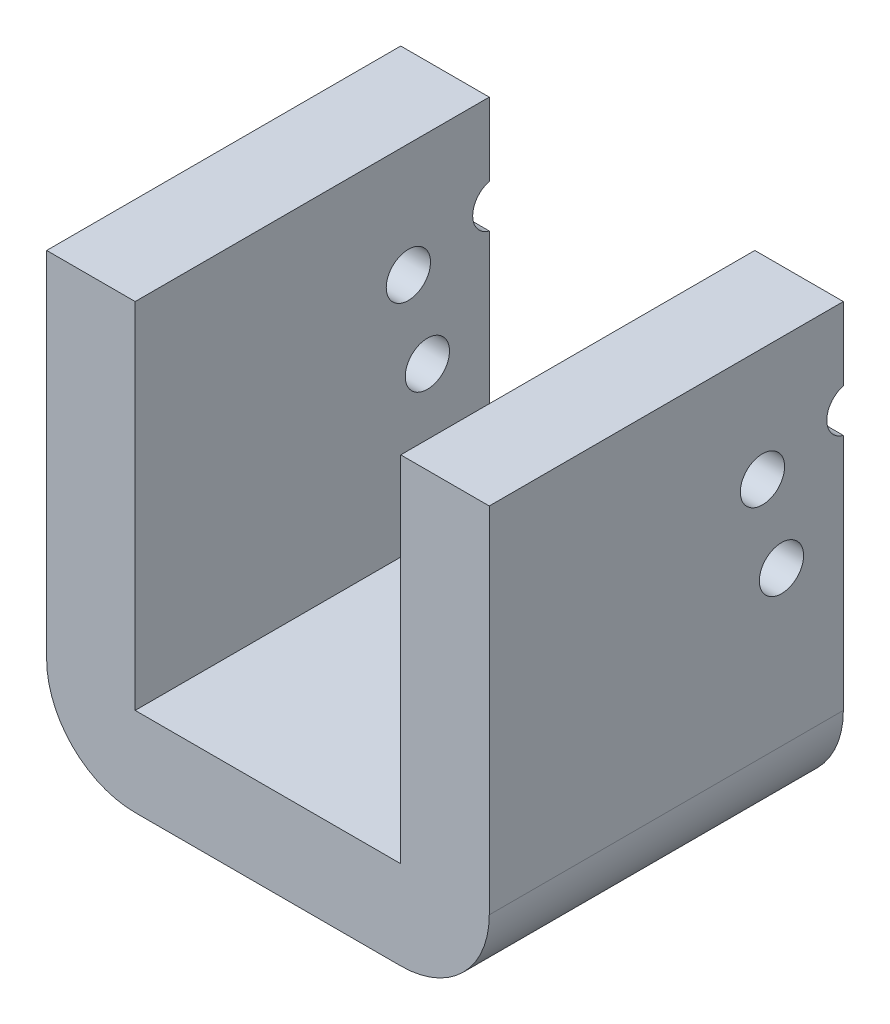
ISO-10303-21;
HEADER;
FILE_DESCRIPTION(('STEP AP214'),'2;1');
FILE_NAME('part.step','',(''),(''),'','','');
FILE_SCHEMA(('AUTOMOTIVE_DESIGN { 1 0 10303 214 1 1 1 1 }'));
ENDSEC;
DATA;
#1=APPLICATION_CONTEXT('core data for automotive mechanical design processes');
#2=APPLICATION_PROTOCOL_DEFINITION('international standard','automotive_design',2000,#1);
#3=PRODUCT_CONTEXT('',#1,'mechanical');
#4=PRODUCT('Part','Part','',(#3));
#5=PRODUCT_RELATED_PRODUCT_CATEGORY('part','',(#4));
#6=PRODUCT_DEFINITION_FORMATION('','',#4);
#7=PRODUCT_DEFINITION_CONTEXT('part definition',#1,'design');
#8=PRODUCT_DEFINITION('design','',#6,#7);
#9=PRODUCT_DEFINITION_SHAPE('','',#8);
#10=(LENGTH_UNIT() NAMED_UNIT(*) SI_UNIT(.MILLI.,.METRE.));
#11=(NAMED_UNIT(*) PLANE_ANGLE_UNIT() SI_UNIT($,.RADIAN.));
#12=(NAMED_UNIT(*) SI_UNIT($,.STERADIAN.) SOLID_ANGLE_UNIT());
#13=UNCERTAINTY_MEASURE_WITH_UNIT(LENGTH_MEASURE(1.E-05),#10,'distance_accuracy_value','');
#14=(GEOMETRIC_REPRESENTATION_CONTEXT(3) GLOBAL_UNCERTAINTY_ASSIGNED_CONTEXT((#13)) GLOBAL_UNIT_ASSIGNED_CONTEXT((#10,
#11,#12)) REPRESENTATION_CONTEXT('',''));
#15=CARTESIAN_POINT('',(0.,0.,0.));
#16=DIRECTION('',(0.,0.,1.));
#17=DIRECTION('',(1.,0.,0.));
#18=AXIS2_PLACEMENT_3D('',#15,#16,#17);
#19=CARTESIAN_POINT('',(0.,0.,0.));
#20=DIRECTION('',(0.,0.,-1.));
#21=DIRECTION('',(-1.,0.,0.));
#22=AXIS2_PLACEMENT_3D('',#19,#20,#21);
#23=PLANE('',#22);
#24=DIRECTION('',(-1.,0.,0.));
#25=VECTOR('',#24,1.);
#26=CARTESIAN_POINT('',(60.,36.9057321288444,0.));
#27=LINE('',#26,#25);
#28=CARTESIAN_POINT('',(50.,36.9057321288444,0.));
#29=VERTEX_POINT('',#28);
#30=CARTESIAN_POINT('',(40.,36.9057321288444,0.));
#31=VERTEX_POINT('',#30);
#32=EDGE_CURVE('E11',#29,#31,#27,.T.);
#33=ORIENTED_EDGE('',*,*,#32,.F.);
#34=DIRECTION('',(0.,1.,0.));
#35=VECTOR('',#34,1.);
#36=CARTESIAN_POINT('',(50.,50.,0.));
#37=LINE('',#36,#35);
#38=CARTESIAN_POINT('',(50.,9.99999999999999,0.));
#39=VERTEX_POINT('',#38);
#40=EDGE_CURVE('E222',#39,#29,#37,.T.);
#41=ORIENTED_EDGE('',*,*,#40,.F.);
#42=CARTESIAN_POINT('',(40.,9.99999999999999,0.));
#43=DIRECTION('',(0.,0.,-1.));
#44=DIRECTION('',(-1.,0.,0.));
#45=AXIS2_PLACEMENT_3D('',#42,#43,#44);
#46=CIRCLE('',#45,10.);
#47=CARTESIAN_POINT('',(40.,0.,0.));
#48=VERTEX_POINT('',#47);
#49=EDGE_CURVE('E188',#39,#48,#46,.T.);
#50=ORIENTED_EDGE('',*,*,#49,.T.);
#51=DIRECTION('',(1.,0.,0.));
#52=VECTOR('',#51,1.);
#53=CARTESIAN_POINT('',(50.,0.,0.));
#54=LINE('',#53,#52);
#55=CARTESIAN_POINT('',(10.,0.,0.));
#56=VERTEX_POINT('',#55);
#57=EDGE_CURVE('E226',#56,#48,#54,.T.);
#58=ORIENTED_EDGE('',*,*,#57,.F.);
#59=CARTESIAN_POINT('',(10.,10.,0.));
#60=DIRECTION('',(0.,0.,-1.));
#61=DIRECTION('',(-1.,0.,0.));
#62=AXIS2_PLACEMENT_3D('',#59,#60,#61);
#63=CIRCLE('',#62,10.);
#64=CARTESIAN_POINT('',(0.,10.,0.));
#65=VERTEX_POINT('',#64);
#66=EDGE_CURVE('E157',#56,#65,#63,.T.);
#67=ORIENTED_EDGE('',*,*,#66,.T.);
#68=DIRECTION('',(0.,-1.,0.));
#69=VECTOR('',#68,1.);
#70=CARTESIAN_POINT('',(0.,0.,0.));
#71=LINE('',#70,#69);
#72=CARTESIAN_POINT('',(0.,36.9057321288444,0.));
#73=VERTEX_POINT('',#72);
#74=EDGE_CURVE('E148',#73,#65,#71,.T.);
#75=ORIENTED_EDGE('',*,*,#74,.F.);
#76=CARTESIAN_POINT('',(10.,36.9057321288444,0.));
#77=VERTEX_POINT('',#76);
#78=EDGE_CURVE('E43',#77,#73,#27,.T.);
#79=ORIENTED_EDGE('',*,*,#78,.F.);
#80=DIRECTION('',(0.,1.,0.));
#81=VECTOR('',#80,1.);
#82=CARTESIAN_POINT('',(10.,50.,0.));
#83=LINE('',#82,#81);
#84=CARTESIAN_POINT('',(10.,10.,0.));
#85=VERTEX_POINT('',#84);
#86=EDGE_CURVE('E162',#85,#77,#83,.T.);
#87=ORIENTED_EDGE('',*,*,#86,.F.);
#88=DIRECTION('',(-1.,0.,0.));
#89=VECTOR('',#88,1.);
#90=CARTESIAN_POINT('',(10.,10.,0.));
#91=LINE('',#90,#89);
#92=CARTESIAN_POINT('',(40.,10.,0.));
#93=VERTEX_POINT('',#92);
#94=EDGE_CURVE('E213',#93,#85,#91,.T.);
#95=ORIENTED_EDGE('',*,*,#94,.F.);
#96=DIRECTION('',(0.,-1.,0.));
#97=VECTOR('',#96,1.);
#98=CARTESIAN_POINT('',(40.,10.,0.));
#99=LINE('',#98,#97);
#100=EDGE_CURVE('E219',#31,#93,#99,.T.);
#101=ORIENTED_EDGE('',*,*,#100,.F.);
#102=EDGE_LOOP('',(#33,#41,#50,#58,#67,#75,#79,#87,#95,#101));
#103=FACE_BOUND('',#102,.T.);
#104=ADVANCED_FACE('F39',(#103),#23,.T.);
#105=DIRECTION('',(-1.,0.,0.));
#106=VECTOR('',#105,1.);
#107=CARTESIAN_POINT('',(60.,41.7456145954179,0.));
#108=LINE('',#107,#106);
#109=CARTESIAN_POINT('',(0.,41.7456145954179,0.));
#110=VERTEX_POINT('',#109);
#111=CARTESIAN_POINT('',(10.,41.7456145954179,0.));
#112=VERTEX_POINT('',#111);
#113=EDGE_CURVE('E144',#110,#112,#108,.F.);
#114=ORIENTED_EDGE('',*,*,#113,.F.);
#115=CARTESIAN_POINT('',(0.,50.,0.));
#116=VERTEX_POINT('',#115);
#117=EDGE_CURVE('E152',#116,#110,#71,.T.);
#118=ORIENTED_EDGE('',*,*,#117,.F.);
#119=DIRECTION('',(-1.,0.,0.));
#120=VECTOR('',#119,1.);
#121=CARTESIAN_POINT('',(0.,50.,0.));
#122=LINE('',#121,#120);
#123=CARTESIAN_POINT('',(10.,50.,0.));
#124=VERTEX_POINT('',#123);
#125=EDGE_CURVE('E159',#124,#116,#122,.T.);
#126=ORIENTED_EDGE('',*,*,#125,.F.);
#127=EDGE_CURVE('E207',#112,#124,#83,.T.);
#128=ORIENTED_EDGE('',*,*,#127,.F.);
#129=EDGE_LOOP('',(#114,#118,#126,#128));
#130=FACE_BOUND('',#129,.T.);
#131=ADVANCED_FACE('F212',(#130),#23,.T.);
#132=CARTESIAN_POINT('',(50.,0.,40.));
#133=DIRECTION('',(0.,1.,0.));
#134=DIRECTION('',(-1.,0.,0.));
#135=AXIS2_PLACEMENT_3D('',#132,#133,#134);
#136=PLANE('',#135);
#137=ORIENTED_EDGE('',*,*,#57,.T.);
#138=DIRECTION('',(0.,0.,-1.));
#139=VECTOR('',#138,1.);
#140=CARTESIAN_POINT('',(40.,0.,40.));
#141=LINE('',#140,#139);
#142=CARTESIAN_POINT('',(40.,0.,40.));
#143=VERTEX_POINT('',#142);
#144=EDGE_CURVE('E193',#48,#143,#141,.F.);
#145=ORIENTED_EDGE('',*,*,#144,.T.);
#146=DIRECTION('',(1.,0.,0.));
#147=VECTOR('',#146,1.);
#148=CARTESIAN_POINT('',(50.,0.,40.));
#149=LINE('',#148,#147);
#150=CARTESIAN_POINT('',(10.,0.,40.));
#151=VERTEX_POINT('',#150);
#152=EDGE_CURVE('E161',#151,#143,#149,.T.);
#153=ORIENTED_EDGE('',*,*,#152,.F.);
#154=DIRECTION('',(0.,0.,-1.));
#155=VECTOR('',#154,1.);
#156=CARTESIAN_POINT('',(10.,0.,40.));
#157=LINE('',#156,#155);
#158=EDGE_CURVE('E190',#151,#56,#157,.T.);
#159=ORIENTED_EDGE('',*,*,#158,.T.);
#160=EDGE_LOOP('',(#137,#145,#153,#159));
#161=FACE_BOUND('',#160,.T.);
#162=ADVANCED_FACE('F293',(#161),#136,.F.);
#163=CARTESIAN_POINT('',(50.,50.,40.));
#164=DIRECTION('',(-1.,0.,0.));
#165=DIRECTION('',(0.,-1.,0.));
#166=AXIS2_PLACEMENT_3D('',#163,#164,#165);
#167=PLANE('',#166);
#168=CARTESIAN_POINT('',(50.,27.4103411852505,6.98980288674551));
#169=DIRECTION('',(-1.,0.,0.));
#170=DIRECTION('',(0.,-1.,0.));
#171=AXIS2_PLACEMENT_3D('',#168,#169,#170);
#172=CIRCLE('',#171,2.5);
#173=CARTESIAN_POINT('',(50.,24.9103411852505,6.98980288674551));
#174=VERTEX_POINT('',#173);
#175=EDGE_CURVE('E229',#174,#174,#172,.T.);
#176=ORIENTED_EDGE('',*,*,#175,.T.);
#177=EDGE_LOOP('',(#176));
#178=FACE_BOUND('',#177,.T.);
#179=CARTESIAN_POINT('',(50.,37.176709779617,9.13876646925967));
#180=DIRECTION('',(-1.,0.,0.));
#181=DIRECTION('',(0.,-1.,0.));
#182=AXIS2_PLACEMENT_3D('',#179,#180,#181);
#183=CIRCLE('',#182,2.5);
#184=CARTESIAN_POINT('',(50.,34.676709779617,9.13876646925967));
#185=VERTEX_POINT('',#184);
#186=EDGE_CURVE('E254',#185,#185,#183,.T.);
#187=ORIENTED_EDGE('',*,*,#186,.T.);
#188=EDGE_LOOP('',(#187));
#189=FACE_BOUND('',#188,.T.);
#190=ORIENTED_EDGE('',*,*,#40,.T.);
#191=CARTESIAN_POINT('',(50.,39.3256733621311,-0.627602125106819));
#192=DIRECTION('',(-1.,0.,0.));
#193=DIRECTION('',(0.,-1.,0.));
#194=AXIS2_PLACEMENT_3D('',#191,#192,#193);
#195=CIRCLE('',#194,2.5);
#196=CARTESIAN_POINT('',(50.,41.7456145954179,0.));
#197=VERTEX_POINT('',#196);
#198=EDGE_CURVE('E209',#29,#197,#195,.T.);
#199=ORIENTED_EDGE('',*,*,#198,.T.);
#200=CARTESIAN_POINT('',(50.,50.,0.));
#201=VERTEX_POINT('',#200);
#202=EDGE_CURVE('E225',#197,#201,#37,.T.);
#203=ORIENTED_EDGE('',*,*,#202,.T.);
#204=DIRECTION('',(0.,0.,-1.));
#205=VECTOR('',#204,1.);
#206=CARTESIAN_POINT('',(50.,50.,40.));
#207=LINE('',#206,#205);
#208=CARTESIAN_POINT('',(50.,50.,40.));
#209=VERTEX_POINT('',#208);
#210=EDGE_CURVE('E181',#209,#201,#207,.T.);
#211=ORIENTED_EDGE('',*,*,#210,.F.);
#212=DIRECTION('',(0.,1.,0.));
#213=VECTOR('',#212,1.);
#214=CARTESIAN_POINT('',(50.,50.,40.));
#215=LINE('',#214,#213);
#216=CARTESIAN_POINT('',(50.,9.99999999999999,40.));
#217=VERTEX_POINT('',#216);
#218=EDGE_CURVE('E242',#217,#209,#215,.T.);
#219=ORIENTED_EDGE('',*,*,#218,.F.);
#220=DIRECTION('',(0.,0.,-1.));
#221=VECTOR('',#220,1.);
#222=CARTESIAN_POINT('',(50.,9.99999999999999,40.));
#223=LINE('',#222,#221);
#224=EDGE_CURVE('E184',#217,#39,#223,.T.);
#225=ORIENTED_EDGE('',*,*,#224,.T.);
#226=EDGE_LOOP('',(#190,#199,#203,#211,#219,#225));
#227=FACE_BOUND('',#226,.T.);
#228=ADVANCED_FACE('F316',(#178,#189,#227),#167,.F.);
#229=CARTESIAN_POINT('',(40.,50.,40.));
#230=DIRECTION('',(0.,-1.,0.));
#231=DIRECTION('',(0.,0.,-1.));
#232=AXIS2_PLACEMENT_3D('',#229,#230,#231);
#233=PLANE('',#232);
#234=DIRECTION('',(-1.,0.,0.));
#235=VECTOR('',#234,1.);
#236=CARTESIAN_POINT('',(40.,50.,0.));
#237=LINE('',#236,#235);
#238=CARTESIAN_POINT('',(40.,50.,0.));
#239=VERTEX_POINT('',#238);
#240=EDGE_CURVE('E220',#201,#239,#237,.T.);
#241=ORIENTED_EDGE('',*,*,#240,.T.);
#242=DIRECTION('',(0.,0.,-1.));
#243=VECTOR('',#242,1.);
#244=CARTESIAN_POINT('',(40.,50.,40.));
#245=LINE('',#244,#243);
#246=CARTESIAN_POINT('',(40.,50.,40.));
#247=VERTEX_POINT('',#246);
#248=EDGE_CURVE('E178',#247,#239,#245,.T.);
#249=ORIENTED_EDGE('',*,*,#248,.F.);
#250=DIRECTION('',(-1.,0.,0.));
#251=VECTOR('',#250,1.);
#252=CARTESIAN_POINT('',(40.,50.,40.));
#253=LINE('',#252,#251);
#254=EDGE_CURVE('E240',#209,#247,#253,.T.);
#255=ORIENTED_EDGE('',*,*,#254,.F.);
#256=ORIENTED_EDGE('',*,*,#210,.T.);
#257=EDGE_LOOP('',(#241,#249,#255,#256));
#258=FACE_BOUND('',#257,.T.);
#259=ADVANCED_FACE('F312',(#258),#233,.F.);
#260=CARTESIAN_POINT('',(40.,10.,40.));
#261=DIRECTION('',(1.,0.,0.));
#262=DIRECTION('',(0.,1.,0.));
#263=AXIS2_PLACEMENT_3D('',#260,#261,#262);
#264=PLANE('',#263);
#265=CARTESIAN_POINT('',(40.,27.4103411852505,6.98980288674551));
#266=DIRECTION('',(1.,0.,0.));
#267=DIRECTION('',(0.,1.,0.));
#268=AXIS2_PLACEMENT_3D('',#265,#266,#267);
#269=CIRCLE('',#268,2.5);
#270=CARTESIAN_POINT('',(40.,29.9103411852505,6.98980288674551));
#271=VERTEX_POINT('',#270);
#272=EDGE_CURVE('E248',#271,#271,#269,.T.);
#273=ORIENTED_EDGE('',*,*,#272,.T.);
#274=EDGE_LOOP('',(#273));
#275=FACE_BOUND('',#274,.T.);
#276=CARTESIAN_POINT('',(40.,37.176709779617,9.13876646925967));
#277=DIRECTION('',(1.,0.,0.));
#278=DIRECTION('',(0.,1.,0.));
#279=AXIS2_PLACEMENT_3D('',#276,#277,#278);
#280=CIRCLE('',#279,2.5);
#281=CARTESIAN_POINT('',(40.,39.676709779617,9.13876646925967));
#282=VERTEX_POINT('',#281);
#283=EDGE_CURVE('E257',#282,#282,#280,.T.);
#284=ORIENTED_EDGE('',*,*,#283,.T.);
#285=EDGE_LOOP('',(#284));
#286=FACE_BOUND('',#285,.T.);
#287=CARTESIAN_POINT('',(40.,41.7456145954179,0.));
#288=VERTEX_POINT('',#287);
#289=EDGE_CURVE('E214',#239,#288,#99,.T.);
#290=ORIENTED_EDGE('',*,*,#289,.T.);
#291=CARTESIAN_POINT('',(40.,39.3256733621311,-0.627602125106819));
#292=DIRECTION('',(1.,0.,0.));
#293=DIRECTION('',(0.,1.,0.));
#294=AXIS2_PLACEMENT_3D('',#291,#292,#293);
#295=CIRCLE('',#294,2.5);
#296=EDGE_CURVE('E53',#288,#31,#295,.T.);
#297=ORIENTED_EDGE('',*,*,#296,.T.);
#298=ORIENTED_EDGE('',*,*,#100,.T.);
#299=DIRECTION('',(0.,0.,-1.));
#300=VECTOR('',#299,1.);
#301=CARTESIAN_POINT('',(40.,10.,40.));
#302=LINE('',#301,#300);
#303=CARTESIAN_POINT('',(40.,10.,40.));
#304=VERTEX_POINT('',#303);
#305=EDGE_CURVE('E175',#304,#93,#302,.T.);
#306=ORIENTED_EDGE('',*,*,#305,.F.);
#307=DIRECTION('',(0.,-1.,0.));
#308=VECTOR('',#307,1.);
#309=CARTESIAN_POINT('',(40.,10.,40.));
#310=LINE('',#309,#308);
#311=EDGE_CURVE('E238',#247,#304,#310,.T.);
#312=ORIENTED_EDGE('',*,*,#311,.F.);
#313=ORIENTED_EDGE('',*,*,#248,.T.);
#314=EDGE_LOOP('',(#290,#297,#298,#306,#312,#313));
#315=FACE_BOUND('',#314,.T.);
#316=ADVANCED_FACE('F305',(#275,#286,#315),#264,.F.);
#317=CARTESIAN_POINT('',(10.,10.,40.));
#318=DIRECTION('',(0.,-1.,0.));
#319=DIRECTION('',(0.,0.,-1.));
#320=AXIS2_PLACEMENT_3D('',#317,#318,#319);
#321=PLANE('',#320);
#322=ORIENTED_EDGE('',*,*,#94,.T.);
#323=DIRECTION('',(0.,0.,-1.));
#324=VECTOR('',#323,1.);
#325=CARTESIAN_POINT('',(10.,10.,40.));
#326=LINE('',#325,#324);
#327=CARTESIAN_POINT('',(10.,10.,40.));
#328=VERTEX_POINT('',#327);
#329=EDGE_CURVE('E172',#328,#85,#326,.T.);
#330=ORIENTED_EDGE('',*,*,#329,.F.);
#331=DIRECTION('',(-1.,0.,0.));
#332=VECTOR('',#331,1.);
#333=CARTESIAN_POINT('',(10.,10.,40.));
#334=LINE('',#333,#332);
#335=EDGE_CURVE('E236',#304,#328,#334,.T.);
#336=ORIENTED_EDGE('',*,*,#335,.F.);
#337=ORIENTED_EDGE('',*,*,#305,.T.);
#338=EDGE_LOOP('',(#322,#330,#336,#337));
#339=FACE_BOUND('',#338,.T.);
#340=ADVANCED_FACE('F323',(#339),#321,.F.);
#341=CARTESIAN_POINT('',(10.,50.,40.));
#342=DIRECTION('',(-1.,0.,0.));
#343=DIRECTION('',(0.,-1.,0.));
#344=AXIS2_PLACEMENT_3D('',#341,#342,#343);
#345=PLANE('',#344);
#346=CARTESIAN_POINT('',(10.,27.4103411852505,6.98980288674551));
#347=DIRECTION('',(-1.,0.,0.));
#348=DIRECTION('',(0.,-1.,0.));
#349=AXIS2_PLACEMENT_3D('',#346,#347,#348);
#350=CIRCLE('',#349,2.5);
#351=CARTESIAN_POINT('',(10.,24.9103411852505,6.98980288674551));
#352=VERTEX_POINT('',#351);
#353=EDGE_CURVE('E251',#352,#352,#350,.T.);
#354=ORIENTED_EDGE('',*,*,#353,.T.);
#355=EDGE_LOOP('',(#354));
#356=FACE_BOUND('',#355,.T.);
#357=CARTESIAN_POINT('',(10.,37.176709779617,9.13876646925967));
#358=DIRECTION('',(-1.,0.,0.));
#359=DIRECTION('',(0.,-1.,0.));
#360=AXIS2_PLACEMENT_3D('',#357,#358,#359);
#361=CIRCLE('',#360,2.5);
#362=CARTESIAN_POINT('',(10.,34.676709779617,9.13876646925967));
#363=VERTEX_POINT('',#362);
#364=EDGE_CURVE('E208',#363,#363,#361,.T.);
#365=ORIENTED_EDGE('',*,*,#364,.T.);
#366=EDGE_LOOP('',(#365));
#367=FACE_BOUND('',#366,.T.);
#368=ORIENTED_EDGE('',*,*,#86,.T.);
#369=CARTESIAN_POINT('',(10.,39.3256733621311,-0.627602125106819));
#370=DIRECTION('',(-1.,0.,0.));
#371=DIRECTION('',(0.,-1.,0.));
#372=AXIS2_PLACEMENT_3D('',#369,#370,#371);
#373=CIRCLE('',#372,2.5);
#374=EDGE_CURVE('E139',#77,#112,#373,.T.);
#375=ORIENTED_EDGE('',*,*,#374,.T.);
#376=ORIENTED_EDGE('',*,*,#127,.T.);
#377=DIRECTION('',(0.,0.,-1.));
#378=VECTOR('',#377,1.);
#379=CARTESIAN_POINT('',(10.,50.,40.));
#380=LINE('',#379,#378);
#381=CARTESIAN_POINT('',(10.,50.,40.));
#382=VERTEX_POINT('',#381);
#383=EDGE_CURVE('E168',#382,#124,#380,.T.);
#384=ORIENTED_EDGE('',*,*,#383,.F.);
#385=DIRECTION('',(0.,1.,0.));
#386=VECTOR('',#385,1.);
#387=CARTESIAN_POINT('',(10.,50.,40.));
#388=LINE('',#387,#386);
#389=EDGE_CURVE('E234',#328,#382,#388,.T.);
#390=ORIENTED_EDGE('',*,*,#389,.F.);
#391=ORIENTED_EDGE('',*,*,#329,.T.);
#392=EDGE_LOOP('',(#368,#375,#376,#384,#390,#391));
#393=FACE_BOUND('',#392,.T.);
#394=ADVANCED_FACE('F205',(#356,#367,#393),#345,.F.);
#395=CARTESIAN_POINT('',(0.,50.,40.));
#396=DIRECTION('',(0.,-1.,0.));
#397=DIRECTION('',(0.,0.,-1.));
#398=AXIS2_PLACEMENT_3D('',#395,#396,#397);
#399=PLANE('',#398);
#400=ORIENTED_EDGE('',*,*,#125,.T.);
#401=DIRECTION('',(0.,0.,-1.));
#402=VECTOR('',#401,1.);
#403=CARTESIAN_POINT('',(0.,50.,40.));
#404=LINE('',#403,#402);
#405=CARTESIAN_POINT('',(0.,50.,40.));
#406=VERTEX_POINT('',#405);
#407=EDGE_CURVE('E166',#406,#116,#404,.T.);
#408=ORIENTED_EDGE('',*,*,#407,.F.);
#409=DIRECTION('',(-1.,0.,0.));
#410=VECTOR('',#409,1.);
#411=CARTESIAN_POINT('',(0.,50.,40.));
#412=LINE('',#411,#410);
#413=EDGE_CURVE('E232',#382,#406,#412,.T.);
#414=ORIENTED_EDGE('',*,*,#413,.F.);
#415=ORIENTED_EDGE('',*,*,#383,.T.);
#416=EDGE_LOOP('',(#400,#408,#414,#415));
#417=FACE_BOUND('',#416,.T.);
#418=ADVANCED_FACE('F275',(#417),#399,.F.);
#419=CARTESIAN_POINT('',(0.,0.,40.));
#420=DIRECTION('',(1.,0.,0.));
#421=DIRECTION('',(0.,0.,-1.));
#422=AXIS2_PLACEMENT_3D('',#419,#420,#421);
#423=PLANE('',#422);
#424=CARTESIAN_POINT('',(0.,27.4103411852505,6.98980288674551));
#425=DIRECTION('',(-1.,0.,0.));
#426=DIRECTION('',(0.,0.,1.));
#427=AXIS2_PLACEMENT_3D('',#424,#425,#426);
#428=CIRCLE('',#427,2.5);
#429=CARTESIAN_POINT('',(0.,27.4103411852505,9.48980288674551));
#430=VERTEX_POINT('',#429);
#431=EDGE_CURVE('E264',#430,#430,#428,.T.);
#432=ORIENTED_EDGE('',*,*,#431,.F.);
#433=EDGE_LOOP('',(#432));
#434=FACE_BOUND('',#433,.T.);
#435=CARTESIAN_POINT('',(0.,37.176709779617,9.13876646925967));
#436=DIRECTION('',(-1.,0.,0.));
#437=DIRECTION('',(0.,0.,1.));
#438=AXIS2_PLACEMENT_3D('',#435,#436,#437);
#439=CIRCLE('',#438,2.5);
#440=CARTESIAN_POINT('',(0.,37.176709779617,11.6387664692597));
#441=VERTEX_POINT('',#440);
#442=EDGE_CURVE('E153',#441,#441,#439,.T.);
#443=ORIENTED_EDGE('',*,*,#442,.F.);
#444=EDGE_LOOP('',(#443));
#445=FACE_BOUND('',#444,.T.);
#446=ORIENTED_EDGE('',*,*,#117,.T.);
#447=CARTESIAN_POINT('',(0.,39.3256733621311,-0.627602125106819));
#448=DIRECTION('',(-1.,0.,0.));
#449=DIRECTION('',(0.,0.,1.));
#450=AXIS2_PLACEMENT_3D('',#447,#448,#449);
#451=CIRCLE('',#450,2.5);
#452=EDGE_CURVE('E61',#73,#110,#451,.T.);
#453=ORIENTED_EDGE('',*,*,#452,.F.);
#454=ORIENTED_EDGE('',*,*,#74,.T.);
#455=DIRECTION('',(0.,0.,-1.));
#456=VECTOR('',#455,1.);
#457=CARTESIAN_POINT('',(0.,10.,40.));
#458=LINE('',#457,#456);
#459=CARTESIAN_POINT('',(0.,10.,40.));
#460=VERTEX_POINT('',#459);
#461=EDGE_CURVE('E199',#65,#460,#458,.F.);
#462=ORIENTED_EDGE('',*,*,#461,.T.);
#463=DIRECTION('',(0.,-1.,0.));
#464=VECTOR('',#463,1.);
#465=CARTESIAN_POINT('',(0.,0.,40.));
#466=LINE('',#465,#464);
#467=EDGE_CURVE('E169',#406,#460,#466,.T.);
#468=ORIENTED_EDGE('',*,*,#467,.F.);
#469=ORIENTED_EDGE('',*,*,#407,.T.);
#470=EDGE_LOOP('',(#446,#453,#454,#462,#468,#469));
#471=FACE_BOUND('',#470,.T.);
#472=ADVANCED_FACE('F147',(#434,#445,#471),#423,.F.);
#473=CARTESIAN_POINT('',(0.,0.,40.));
#474=DIRECTION('',(0.,0.,-1.));
#475=DIRECTION('',(-1.,0.,0.));
#476=AXIS2_PLACEMENT_3D('',#473,#474,#475);
#477=PLANE('',#476);
#478=ORIENTED_EDGE('',*,*,#152,.T.);
#479=CARTESIAN_POINT('',(40.,9.99999999999999,40.));
#480=DIRECTION('',(0.,0.,-1.));
#481=DIRECTION('',(-1.,0.,0.));
#482=AXIS2_PLACEMENT_3D('',#479,#480,#481);
#483=CIRCLE('',#482,10.);
#484=EDGE_CURVE('E197',#143,#217,#483,.F.);
#485=ORIENTED_EDGE('',*,*,#484,.T.);
#486=ORIENTED_EDGE('',*,*,#218,.T.);
#487=ORIENTED_EDGE('',*,*,#254,.T.);
#488=ORIENTED_EDGE('',*,*,#311,.T.);
#489=ORIENTED_EDGE('',*,*,#335,.T.);
#490=ORIENTED_EDGE('',*,*,#389,.T.);
#491=ORIENTED_EDGE('',*,*,#413,.T.);
#492=ORIENTED_EDGE('',*,*,#467,.T.);
#493=CARTESIAN_POINT('',(10.,10.,40.));
#494=DIRECTION('',(0.,0.,-1.));
#495=DIRECTION('',(-1.,0.,0.));
#496=AXIS2_PLACEMENT_3D('',#493,#494,#495);
#497=CIRCLE('',#496,10.);
#498=EDGE_CURVE('E195',#460,#151,#497,.F.);
#499=ORIENTED_EDGE('',*,*,#498,.T.);
#500=EDGE_LOOP('',(#478,#485,#486,#487,#488,#489,#490,#491,#492,#499));
#501=FACE_BOUND('',#500,.T.);
#502=ADVANCED_FACE('F274',(#501),#477,.F.);
#503=EDGE_CURVE('E200',#288,#197,#108,.F.);
#504=ORIENTED_EDGE('',*,*,#503,.F.);
#505=ORIENTED_EDGE('',*,*,#289,.F.);
#506=ORIENTED_EDGE('',*,*,#240,.F.);
#507=ORIENTED_EDGE('',*,*,#202,.F.);
#508=EDGE_LOOP('',(#504,#505,#506,#507));
#509=FACE_BOUND('',#508,.T.);
#510=ADVANCED_FACE('F282',(#509),#23,.T.);
#511=CARTESIAN_POINT('',(40.,9.99999999999999,40.));
#512=DIRECTION('',(0.,0.,-1.));
#513=DIRECTION('',(-1.,0.,0.));
#514=AXIS2_PLACEMENT_3D('',#511,#512,#513);
#515=CYLINDRICAL_SURFACE('',#514,10.);
#516=ORIENTED_EDGE('',*,*,#484,.F.);
#517=ORIENTED_EDGE('',*,*,#144,.F.);
#518=ORIENTED_EDGE('',*,*,#49,.F.);
#519=ORIENTED_EDGE('',*,*,#224,.F.);
#520=EDGE_LOOP('',(#516,#517,#518,#519));
#521=FACE_BOUND('',#520,.T.);
#522=ADVANCED_FACE('F295',(#521),#515,.T.);
#523=CARTESIAN_POINT('',(10.,10.,40.));
#524=DIRECTION('',(0.,0.,-1.));
#525=DIRECTION('',(-1.,0.,0.));
#526=AXIS2_PLACEMENT_3D('',#523,#524,#525);
#527=CYLINDRICAL_SURFACE('',#526,10.);
#528=ORIENTED_EDGE('',*,*,#498,.F.);
#529=ORIENTED_EDGE('',*,*,#461,.F.);
#530=ORIENTED_EDGE('',*,*,#66,.F.);
#531=ORIENTED_EDGE('',*,*,#158,.F.);
#532=EDGE_LOOP('',(#528,#529,#530,#531));
#533=FACE_BOUND('',#532,.T.);
#534=ADVANCED_FACE('F41',(#533),#527,.T.);
#535=CARTESIAN_POINT('',(60.,39.3256733621311,-0.627602125106819));
#536=DIRECTION('',(-1.,0.,0.));
#537=DIRECTION('',(0.,0.,1.));
#538=AXIS2_PLACEMENT_3D('',#535,#536,#537);
#539=CYLINDRICAL_SURFACE('',#538,2.5);
#540=ORIENTED_EDGE('',*,*,#32,.T.);
#541=ORIENTED_EDGE('',*,*,#296,.F.);
#542=ORIENTED_EDGE('',*,*,#503,.T.);
#543=ORIENTED_EDGE('',*,*,#198,.F.);
#544=EDGE_LOOP('',(#540,#541,#542,#543));
#545=FACE_BOUND('',#544,.T.);
#546=ADVANCED_FACE('F319',(#545),#539,.F.);
#547=ORIENTED_EDGE('',*,*,#78,.T.);
#548=ORIENTED_EDGE('',*,*,#452,.T.);
#549=ORIENTED_EDGE('',*,*,#113,.T.);
#550=ORIENTED_EDGE('',*,*,#374,.F.);
#551=EDGE_LOOP('',(#547,#548,#549,#550));
#552=FACE_BOUND('',#551,.T.);
#553=ADVANCED_FACE('F137',(#552),#539,.F.);
#554=CARTESIAN_POINT('',(60.,37.176709779617,9.13876646925967));
#555=DIRECTION('',(-1.,0.,0.));
#556=DIRECTION('',(0.,0.,1.));
#557=AXIS2_PLACEMENT_3D('',#554,#555,#556);
#558=CYLINDRICAL_SURFACE('',#557,2.5);
#559=ORIENTED_EDGE('',*,*,#442,.T.);
#560=EDGE_LOOP('',(#559));
#561=FACE_BOUND('',#560,.T.);
#562=ORIENTED_EDGE('',*,*,#364,.F.);
#563=EDGE_LOOP('',(#562));
#564=FACE_BOUND('',#563,.T.);
#565=ADVANCED_FACE('F270',(#561,#564),#558,.F.);
#566=CARTESIAN_POINT('',(60.,27.4103411852505,6.98980288674551));
#567=DIRECTION('',(-1.,0.,0.));
#568=DIRECTION('',(0.,0.,1.));
#569=AXIS2_PLACEMENT_3D('',#566,#567,#568);
#570=CYLINDRICAL_SURFACE('',#569,2.5);
#571=ORIENTED_EDGE('',*,*,#431,.T.);
#572=EDGE_LOOP('',(#571));
#573=FACE_BOUND('',#572,.T.);
#574=ORIENTED_EDGE('',*,*,#353,.F.);
#575=EDGE_LOOP('',(#574));
#576=FACE_BOUND('',#575,.T.);
#577=ADVANCED_FACE('F350',(#573,#576),#570,.F.);
#578=ORIENTED_EDGE('',*,*,#283,.F.);
#579=EDGE_LOOP('',(#578));
#580=FACE_BOUND('',#579,.T.);
#581=ORIENTED_EDGE('',*,*,#186,.F.);
#582=EDGE_LOOP('',(#581));
#583=FACE_BOUND('',#582,.T.);
#584=ADVANCED_FACE('F348',(#580,#583),#558,.F.);
#585=ORIENTED_EDGE('',*,*,#272,.F.);
#586=EDGE_LOOP('',(#585));
#587=FACE_BOUND('',#586,.T.);
#588=ORIENTED_EDGE('',*,*,#175,.F.);
#589=EDGE_LOOP('',(#588));
#590=FACE_BOUND('',#589,.T.);
#591=ADVANCED_FACE('F345',(#587,#590),#570,.F.);
#592=CLOSED_SHELL('',(#104,#131,#162,#228,#259,#316,#340,#394,#418,#472,#502,#510,#522,#534,
#546,#553,#565,#577,#584,#591));
#593=MANIFOLD_SOLID_BREP('B2',#592);
#594=ADVANCED_BREP_SHAPE_REPRESENTATION('',(#18,#593),#14);
#595=SHAPE_DEFINITION_REPRESENTATION(#9,#594);
ENDSEC;
END-ISO-10303-21;
